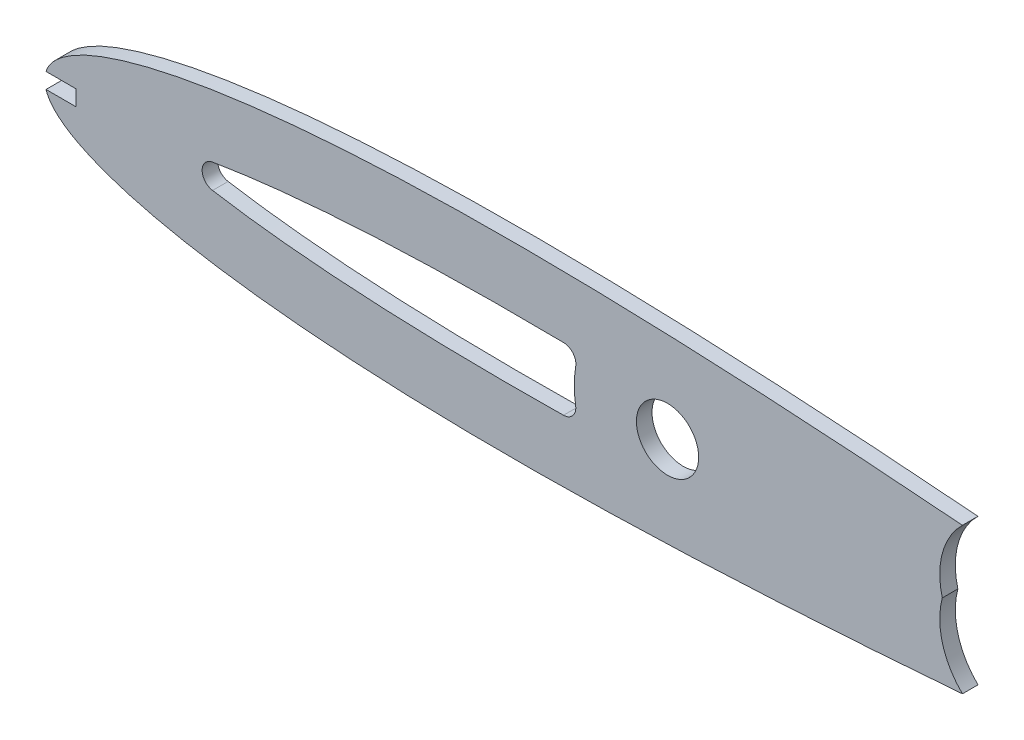
ISO-10303-21;
HEADER;
FILE_DESCRIPTION(('STEP AP214'),'2;1');
FILE_NAME('part.step','',(''),(''),'','','');
FILE_SCHEMA(('AUTOMOTIVE_DESIGN { 1 0 10303 214 1 1 1 1 }'));
ENDSEC;
DATA;
#1=APPLICATION_CONTEXT('core data for automotive mechanical design processes');
#2=APPLICATION_PROTOCOL_DEFINITION('international standard','automotive_design',2000,#1);
#3=PRODUCT_CONTEXT('',#1,'mechanical');
#4=PRODUCT('Part','Part','',(#3));
#5=PRODUCT_RELATED_PRODUCT_CATEGORY('part','',(#4));
#6=PRODUCT_DEFINITION_FORMATION('','',#4);
#7=PRODUCT_DEFINITION_CONTEXT('part definition',#1,'design');
#8=PRODUCT_DEFINITION('design','',#6,#7);
#9=PRODUCT_DEFINITION_SHAPE('','',#8);
#10=(LENGTH_UNIT() NAMED_UNIT(*) SI_UNIT(.MILLI.,.METRE.));
#11=(NAMED_UNIT(*) PLANE_ANGLE_UNIT() SI_UNIT($,.RADIAN.));
#12=(NAMED_UNIT(*) SI_UNIT($,.STERADIAN.) SOLID_ANGLE_UNIT());
#13=UNCERTAINTY_MEASURE_WITH_UNIT(LENGTH_MEASURE(1.E-05),#10,'distance_accuracy_value','');
#14=(GEOMETRIC_REPRESENTATION_CONTEXT(3) GLOBAL_UNCERTAINTY_ASSIGNED_CONTEXT((#13)) GLOBAL_UNIT_ASSIGNED_CONTEXT((#10,
#11,#12)) REPRESENTATION_CONTEXT('',''));
#15=CARTESIAN_POINT('',(0.,0.,0.));
#16=DIRECTION('',(0.,0.,1.));
#17=DIRECTION('',(1.,0.,0.));
#18=AXIS2_PLACEMENT_3D('',#15,#16,#17);
#19=CARTESIAN_POINT('',(34.6393154258819,0.0620980403597377,0.));
#20=DIRECTION('',(0.,0.,1.));
#21=DIRECTION('',(1.,0.,0.));
#22=AXIS2_PLACEMENT_3D('',#19,#20,#21);
#23=CYLINDRICAL_SURFACE('',#22,2.54);
#24=DIRECTION('',(0.,0.,1.));
#25=VECTOR('',#24,1.);
#26=CARTESIAN_POINT('',(34.2198267879566,-2.44302257203632,0.));
#27=LINE('',#26,#25);
#28=CARTESIAN_POINT('',(34.2198267879566,-2.44302257203632,0.));
#29=VERTEX_POINT('',#28);
#30=CARTESIAN_POINT('',(34.2198267879566,-2.44302257203632,3.175));
#31=VERTEX_POINT('',#30);
#32=EDGE_CURVE('E292',#29,#31,#27,.T.);
#33=ORIENTED_EDGE('',*,*,#32,.F.);
#34=CARTESIAN_POINT('',(34.6393154258819,0.0620980403597377,0.));
#35=DIRECTION('',(0.,0.,-1.));
#36=DIRECTION('',(-1.,0.,0.));
#37=AXIS2_PLACEMENT_3D('',#34,#35,#36);
#38=CIRCLE('',#37,2.54);
#39=CARTESIAN_POINT('',(34.2198267879563,2.56721865275575,0.));
#40=VERTEX_POINT('',#39);
#41=EDGE_CURVE('E284',#29,#40,#38,.T.);
#42=ORIENTED_EDGE('',*,*,#41,.T.);
#43=DIRECTION('',(0.,0.,1.));
#44=VECTOR('',#43,1.);
#45=CARTESIAN_POINT('',(34.2198267879563,2.56721865275575,3.175));
#46=LINE('',#45,#44);
#47=CARTESIAN_POINT('',(34.2198267879563,2.56721865275575,3.175));
#48=VERTEX_POINT('',#47);
#49=EDGE_CURVE('E288',#48,#40,#46,.F.);
#50=ORIENTED_EDGE('',*,*,#49,.F.);
#51=CARTESIAN_POINT('',(34.6393154258819,0.0620980403597377,3.175));
#52=DIRECTION('',(0.,0.,-1.));
#53=DIRECTION('',(-1.,0.,0.));
#54=AXIS2_PLACEMENT_3D('',#51,#52,#53);
#55=CIRCLE('',#54,2.54);
#56=EDGE_CURVE('E281',#48,#31,#55,.F.);
#57=ORIENTED_EDGE('',*,*,#56,.T.);
#58=EDGE_LOOP('',(#33,#42,#50,#57));
#59=FACE_BOUND('',#58,.T.);
#60=ADVANCED_FACE('F40',(#59),#23,.F.);
#61=CARTESIAN_POINT('',(0.0170900845920282,-0.403411610866982,3.175));
#62=DIRECTION('',(0.,0.,-1.));
#63=DIRECTION('',(-1.,0.,0.));
#64=AXIS2_PLACEMENT_3D('',#61,#62,#63);
#65=PLANE('',#64);
#66=CARTESIAN_POINT('',(127.,0.,3.175));
#67=DIRECTION('',(0.,0.,1.));
#68=DIRECTION('',(1.,0.,0.));
#69=AXIS2_PLACEMENT_3D('',#66,#67,#68);
#70=CIRCLE('',#69,6.35);
#71=CARTESIAN_POINT('',(133.35,0.,3.175));
#72=VERTEX_POINT('',#71);
#73=EDGE_CURVE('E210',#72,#72,#70,.T.);
#74=ORIENTED_EDGE('',*,*,#73,.F.);
#75=EDGE_LOOP('',(#74));
#76=FACE_BOUND('',#75,.T.);
#77=CARTESIAN_POINT('',(318.77,0.4016502,3.175));
#78=CARTESIAN_POINT('',(318.651672050798,0.50081062510207,3.175));
#79=CARTESIAN_POINT('',(317.88713952083,0.407183951533016,3.175));
#80=CARTESIAN_POINT('',(316.525702267064,0.7904298347905,3.175));
#81=CARTESIAN_POINT('',(314.029007456015,1.02731081399014,3.175));
#82=CARTESIAN_POINT('',(310.665580367581,1.53568645613262,3.175));
#83=CARTESIAN_POINT('',(306.332982445315,2.1029997142592,3.175));
#84=CARTESIAN_POINT('',(301.108142880642,2.80218722429085,3.175));
#85=CARTESIAN_POINT('',(295.004655139781,3.59255228155884,3.175));
#86=CARTESIAN_POINT('',(288.066717305627,4.47252129999186,3.175));
#87=CARTESIAN_POINT('',(280.334877507848,5.42667867616247,3.175));
#88=CARTESIAN_POINT('',(271.857503413929,6.44211126091389,3.175));
#89=CARTESIAN_POINT('',(262.68670258513,7.50622472654808,3.175));
#90=CARTESIAN_POINT('',(252.878949160097,8.60453143464443,3.175));
#91=CARTESIAN_POINT('',(242.494745531819,9.72362194936592,3.175));
#92=CARTESIAN_POINT('',(231.598187206488,10.8495970231666,3.175));
#93=CARTESIAN_POINT('',(220.256428580463,11.9679230852741,3.175));
#94=CARTESIAN_POINT('',(208.539426289446,13.0629021970691,3.175));
#95=CARTESIAN_POINT('',(196.519338709918,14.1201595424354,3.175));
#96=CARTESIAN_POINT('',(184.270405083069,15.1220196708537,3.175));
#97=CARTESIAN_POINT('',(171.867889748649,16.0521472129467,3.175));
#98=CARTESIAN_POINT('',(159.388371015463,16.8932736087619,3.175));
#99=CARTESIAN_POINT('',(146.908740176365,17.6278116310836,3.175));
#100=CARTESIAN_POINT('',(134.505824676557,18.23720410278,3.175));
#101=CARTESIAN_POINT('',(122.256224526093,18.705201006698,3.175));
#102=CARTESIAN_POINT('',(110.23510919994,19.0165345268771,3.175));
#103=CARTESIAN_POINT('',(98.5167667377854,19.1559979551147,3.175));
#104=CARTESIAN_POINT('',(87.1732015056204,19.1125234147679,3.175));
#105=CARTESIAN_POINT('',(76.2743495407503,18.8777134468916,3.175));
#106=CARTESIAN_POINT('',(65.8872982521429,18.4456158754961,3.175));
#107=CARTESIAN_POINT('',(56.0759819312477,17.8151004006929,3.175));
#108=CARTESIAN_POINT('',(46.9007012854392,16.9880642018893,3.175));
#109=CARTESIAN_POINT('',(38.4176025007467,15.9709664672286,3.175));
#110=CARTESIAN_POINT('',(30.6783927826995,14.7724611931374,3.175));
#111=CARTESIAN_POINT('',(23.7299698701266,13.4050657428601,3.175));
#112=CARTESIAN_POINT('',(17.6130594258367,11.8842416218078,3.175));
#113=CARTESIAN_POINT('',(12.3624203887116,10.2248187616682,3.175));
#114=CARTESIAN_POINT('',(8.00472945000562,8.44225238170004,3.175));
#115=CARTESIAN_POINT('',(4.55388340735938,6.54860238146803,3.175));
#116=CARTESIAN_POINT('',(2.01519229032135,4.54013127991722,3.175));
#117=CARTESIAN_POINT('',(0.389181284538515,2.36824959719999,3.175));
#118=CARTESIAN_POINT('',(-0.181372315669338,0.,3.175));
#119=CARTESIAN_POINT('',(0.389181284538492,-2.36824959719995,3.175));
#120=CARTESIAN_POINT('',(2.01519229032142,-4.5401312799173,3.175));
#121=CARTESIAN_POINT('',(4.55388340735933,-6.54860238146799,3.175));
#122=CARTESIAN_POINT('',(8.00472945000561,-8.44225238170004,3.175));
#123=CARTESIAN_POINT('',(12.3624203887116,-10.2248187616682,3.175));
#124=CARTESIAN_POINT('',(17.6130594258367,-11.8842416218078,3.175));
#125=CARTESIAN_POINT('',(23.7299698701266,-13.4050657428601,3.175));
#126=CARTESIAN_POINT('',(30.6783927826996,-14.7724611931374,3.175));
#127=CARTESIAN_POINT('',(38.4176025007467,-15.9709664672285,3.175));
#128=CARTESIAN_POINT('',(46.9007012854392,-16.9880642018893,3.175));
#129=CARTESIAN_POINT('',(56.0759819312477,-17.8151004006929,3.175));
#130=CARTESIAN_POINT('',(65.8872982521429,-18.4456158754961,3.175));
#131=CARTESIAN_POINT('',(76.2743495407503,-18.8777134468916,3.175));
#132=CARTESIAN_POINT('',(87.1732015056205,-19.1125234147679,3.175));
#133=CARTESIAN_POINT('',(98.5167667377854,-19.1559979551147,3.175));
#134=CARTESIAN_POINT('',(110.23510919994,-19.0165345268771,3.175));
#135=CARTESIAN_POINT('',(122.256224526093,-18.705201006698,3.175));
#136=CARTESIAN_POINT('',(134.505824676556,-18.23720410278,3.175));
#137=CARTESIAN_POINT('',(146.908740176365,-17.6278116310836,3.175));
#138=CARTESIAN_POINT('',(159.388371015463,-16.8932736087619,3.175));
#139=CARTESIAN_POINT('',(171.867889748649,-16.0521472129467,3.175));
#140=CARTESIAN_POINT('',(184.270405083069,-15.1220196708537,3.175));
#141=CARTESIAN_POINT('',(196.519338709918,-14.1201595424354,3.175));
#142=CARTESIAN_POINT('',(208.539426289446,-13.0629021970691,3.175));
#143=CARTESIAN_POINT('',(220.256428580463,-11.9679230852741,3.175));
#144=CARTESIAN_POINT('',(231.598187206488,-10.8495970231665,3.175));
#145=CARTESIAN_POINT('',(242.494745531819,-9.72362194936593,3.175));
#146=CARTESIAN_POINT('',(252.878949160097,-8.60453143464443,3.175));
#147=CARTESIAN_POINT('',(262.68670258513,-7.50622472654809,3.175));
#148=CARTESIAN_POINT('',(271.857503413929,-6.44211126091389,3.175));
#149=CARTESIAN_POINT('',(280.334877507848,-5.42667867616247,3.175));
#150=CARTESIAN_POINT('',(288.066717305627,-4.47252129999186,3.175));
#151=CARTESIAN_POINT('',(295.004655139781,-3.59255228155884,3.175));
#152=CARTESIAN_POINT('',(301.108142880642,-2.80218722429085,3.175));
#153=CARTESIAN_POINT('',(306.332982445315,-2.10299971425921,3.175));
#154=CARTESIAN_POINT('',(310.66558036758,-1.53568645613261,3.175));
#155=CARTESIAN_POINT('',(314.029007456015,-1.02731081399015,3.175));
#156=CARTESIAN_POINT('',(316.525702267064,-0.790429834790499,3.175));
#157=CARTESIAN_POINT('',(317.88713952083,-0.407183951532999,3.175));
#158=CARTESIAN_POINT('',(318.961628570184,-0.538768719393173,3.175));
#159=CARTESIAN_POINT('',(318.961628570184,0.241062861088163,3.175));
#160=CARTESIAN_POINT('',(318.77,0.4016502,3.175));
#161=B_SPLINE_CURVE_WITH_KNOTS('',3,(#77,#78,#79,#80,#81,#82,#83,#84,#85,#86,#87,#88,#89,#90,
#91,#92,#93,#94,#95,#96,#97,#98,#99,#100,#101,#102,#103,#104,#105,#106,#107,#108,#109,#110,#111,
#112,#113,#114,#115,#116,#117,#118,#119,#120,#121,#122,#123,#124,#125,#126,#127,#128,#129,#130,
#131,#132,#133,#134,#135,#136,#137,#138,#139,#140,#141,#142,#143,#144,#145,#146,#147,#148,#149,
#150,#151,#152,#153,#154,#155,#156,#157,#158,#159,#160),.UNSPECIFIED.,.T.,.F.,(4,1,1,1,1,1,1,1,
1,1,1,1,1,1,1,1,1,1,1,1,1,1,1,1,1,1,1,1,1,1,1,1,1,1,1,1,1,1,1,1,1,1,1,1,1,1,1,1,1,1,1,1,1,1,1,1,
1,1,1,1,1,1,1,1,1,1,1,1,1,1,1,1,1,1,1,1,1,1,1,1,1,4),(0.,0.00076221465102857,
0.00304470631082172,0.00683224554312919,0.0121011758037585,0.0188175356586858,0.026939454793122,
0.0364148482585568,0.0471846285955964,0.0591804130998147,0.0723278736139124,0.0865440610891483,
0.101740580336553,0.117823336433574,0.134691452208322,0.152240154447155,0.170361289964637,
0.188941007849542,0.207865435445639,0.227016078022501,0.246275695980001,0.265524943249896,
0.284644966110444,0.303520118268662,0.322034575374331,0.340078352914118,0.357542593241702,
0.374325481920834,0.390329890871888,0.405463889739095,0.419643801445685,0.43279337139134,
0.444843816743186,0.455737920704734,0.465428653233085,0.473886320085416,0.481101634077569,
0.487101684418678,0.491975368345093,0.495930677807379,0.499382808099288,0.502834938391198,
0.506790247853484,0.511663931779899,0.517663982121008,0.524879296113161,0.533336962965492,
0.543027695493843,0.553921799455391,0.565972244807237,0.579121814752892,0.593301726459482,
0.608435725326689,0.624440134277742,0.641223022956875,0.658687263284459,0.676731040824246,
0.695245497929915,0.714120650088133,0.733240672948681,0.752489920218576,0.771749538176075,
0.790900180752937,0.809824608349034,0.82840432623394,0.846525461751422,0.864074163990254,
0.880942279765002,0.897025035862024,0.912221555109428,0.926437742584664,0.939585203098762,
0.95158098760298,0.96235076794002,0.971826161405454,0.97994808053989,0.986664440394818,
0.991933370655447,0.995720909887755,0.998003401547548,0.998765616198576,1.),.UNSPECIFIED.);
#162=CARTESIAN_POINT('',(0.257834417446085,-1.5875,3.175));
#163=VERTEX_POINT('',#162);
#164=CARTESIAN_POINT('',(187.131379050379,-14.8815283728172,3.175));
#165=VERTEX_POINT('',#164);
#166=EDGE_CURVE('E160',#163,#165,#161,.T.);
#167=ORIENTED_EDGE('',*,*,#166,.T.);
#168=CARTESIAN_POINT('',(197.744431020284,-3.94440224736243,3.175));
#169=DIRECTION('',(0.,0.,1.));
#170=DIRECTION('',(1.,0.,0.));
#171=AXIS2_PLACEMENT_3D('',#168,#169,#170);
#172=CIRCLE('',#171,15.24);
#173=CARTESIAN_POINT('',(183.023721427638,0.,3.175));
#174=VERTEX_POINT('',#173);
#175=EDGE_CURVE('E147',#174,#165,#172,.T.);
#176=ORIENTED_EDGE('',*,*,#175,.F.);
#177=CARTESIAN_POINT('',(197.744431020284,3.94440224736244,3.175));
#178=DIRECTION('',(0.,0.,1.));
#179=DIRECTION('',(1.,0.,0.));
#180=AXIS2_PLACEMENT_3D('',#177,#178,#179);
#181=CIRCLE('',#180,15.24);
#182=CARTESIAN_POINT('',(187.131379050379,14.8815283728172,3.175));
#183=VERTEX_POINT('',#182);
#184=EDGE_CURVE('E135',#183,#174,#181,.T.);
#185=ORIENTED_EDGE('',*,*,#184,.F.);
#186=CARTESIAN_POINT('',(0.257834424287373,1.5875,3.175));
#187=VERTEX_POINT('',#186);
#188=EDGE_CURVE('E225',#183,#187,#161,.T.);
#189=ORIENTED_EDGE('',*,*,#188,.T.);
#190=DIRECTION('',(-1.,0.,0.));
#191=VECTOR('',#190,1.);
#192=CARTESIAN_POINT('',(6.35,1.5875,3.175));
#193=LINE('',#192,#191);
#194=CARTESIAN_POINT('',(6.35,1.5875,3.175));
#195=VERTEX_POINT('',#194);
#196=EDGE_CURVE('E175',#195,#187,#193,.T.);
#197=ORIENTED_EDGE('',*,*,#196,.F.);
#198=DIRECTION('',(0.,-1.,0.));
#199=VECTOR('',#198,1.);
#200=CARTESIAN_POINT('',(6.35,1.5875,3.175));
#201=LINE('',#200,#199);
#202=CARTESIAN_POINT('',(6.35,-1.5875,3.175));
#203=VERTEX_POINT('',#202);
#204=EDGE_CURVE('E181',#195,#203,#201,.T.);
#205=ORIENTED_EDGE('',*,*,#204,.T.);
#206=DIRECTION('',(-1.,0.,0.));
#207=VECTOR('',#206,1.);
#208=CARTESIAN_POINT('',(6.35,-1.5875,3.175));
#209=LINE('',#208,#207);
#210=EDGE_CURVE('E192',#203,#163,#209,.T.);
#211=ORIENTED_EDGE('',*,*,#210,.T.);
#212=EDGE_LOOP('',(#167,#176,#185,#189,#197,#205,#211));
#213=FACE_BOUND('',#212,.T.);
#214=CARTESIAN_POINT('',(127.,0.,3.175));
#215=DIRECTION('',(0.,0.,-1.));
#216=DIRECTION('',(1.,0.,0.));
#217=AXIS2_PLACEMENT_3D('',#214,#215,#216);
#218=CIRCLE('',#217,19.05);
#219=CARTESIAN_POINT('',(108.250589861381,-3.37077431072522,3.175));
#220=VERTEX_POINT('',#219);
#221=CARTESIAN_POINT('',(108.270570821231,3.4800837112767,3.175));
#222=VERTEX_POINT('',#221);
#223=EDGE_CURVE('E360',#220,#222,#218,.T.);
#224=ORIENTED_EDGE('',*,*,#223,.F.);
#225=CARTESIAN_POINT('',(105.750668509565,-3.82021088548858,3.175));
#226=DIRECTION('',(0.,0.,-1.));
#227=DIRECTION('',(-1.,0.,0.));
#228=AXIS2_PLACEMENT_3D('',#225,#226,#227);
#229=CIRCLE('',#228,2.54);
#230=CARTESIAN_POINT('',(105.78563504113,-6.35997019331095,3.175));
#231=VERTEX_POINT('',#230);
#232=EDGE_CURVE('E265',#220,#231,#229,.T.);
#233=ORIENTED_EDGE('',*,*,#232,.T.);
#234=CARTESIAN_POINT('',(22.3075001538087,0.0620980403591206,3.175));
#235=CARTESIAN_POINT('',(22.366805434694,0.0463599552269764,3.175));
#236=CARTESIAN_POINT('',(22.4641575743674,0.0206307576100526,3.175));
#237=CARTESIAN_POINT('',(23.2116228860384,-0.175596789517985,3.175));
#238=CARTESIAN_POINT('',(24.6595160973937,-0.537941707269228,3.175));
#239=CARTESIAN_POINT('',(27.6590804680787,-1.22392879960898,3.175));
#240=CARTESIAN_POINT('',(31.6148674012278,-2.01137925455217,3.175));
#241=CARTESIAN_POINT('',(36.4764457954045,-2.82760799183878,3.175));
#242=CARTESIAN_POINT('',(43.0528389793576,-3.76280952629645,3.175));
#243=CARTESIAN_POINT('',(51.4085727700648,-4.68431192061461,3.175));
#244=CARTESIAN_POINT('',(64.9446034358027,-5.73864722919803,3.175));
#245=CARTESIAN_POINT('',(80.7029524920726,-6.36035669842717,3.175));
#246=CARTESIAN_POINT('',(94.8432621201463,-6.46161549846858,3.175));
#247=CARTESIAN_POINT('',(103.83524223639,-6.39018445634634,3.175));
#248=CARTESIAN_POINT('',(107.294557686626,-6.33959590129162,3.175));
#249=CARTESIAN_POINT('',(109.024993683417,-6.30885472322853,3.175));
#250=B_SPLINE_CURVE_WITH_KNOTS('',3,(#234,#235,#236,#237,#238,#239,#240,#241,#242,#243,#244,
#245,#246,#247,#248,#249),.UNSPECIFIED.,.F.,.F.,(4,1,1,1,1,1,1,1,1,1,1,1,1,4),
(0.536010578880515,0.536329989431581,0.536542929798959,0.540060983851749,0.544111388822982,
0.552212198765449,0.560313008707916,0.568413818650383,0.584615438535317,0.600817058420251,
0.633220298190119,0.65917402529176,0.667274835234226,0.675375645176706),.UNSPECIFIED.);
#251=EDGE_CURVE('E423',#31,#231,#250,.T.);
#252=ORIENTED_EDGE('',*,*,#251,.F.);
#253=ORIENTED_EDGE('',*,*,#56,.F.);
#254=CARTESIAN_POINT('',(109.068787507412,6.43227164737678,3.175));
#255=CARTESIAN_POINT('',(107.323740388384,6.46336480746945,3.175));
#256=CARTESIAN_POINT('',(103.8498191486,6.51426474010784,3.175));
#257=CARTESIAN_POINT('',(94.8432621201402,6.5858115791963,3.175));
#258=CARTESIAN_POINT('',(80.7029524920684,6.48455277915276,3.175));
#259=CARTESIAN_POINT('',(64.9446034358007,5.8628433099214,3.175));
#260=CARTESIAN_POINT('',(51.4085727700634,4.80850800133612,3.175));
#261=CARTESIAN_POINT('',(43.0528389793568,3.8870056070169,3.175));
#262=CARTESIAN_POINT('',(36.476445795404,2.95180407255844,3.175));
#263=CARTESIAN_POINT('',(31.6148674012275,2.13557533527128,3.175));
#264=CARTESIAN_POINT('',(27.6590804680785,1.34812488032769,3.175));
#265=CARTESIAN_POINT('',(24.6595160973903,0.662137787986875,3.175));
#266=CARTESIAN_POINT('',(23.2116228860331,0.299792870234967,3.175));
#267=CARTESIAN_POINT('',(22.4641575743621,0.103565323106815,3.175));
#268=CARTESIAN_POINT('',(22.3668054346921,0.077836125490745,3.175));
#269=CARTESIAN_POINT('',(22.3075001538087,0.0620980403591206,3.175));
#270=B_SPLINE_CURVE_WITH_KNOTS('',3,(#254,#255,#256,#257,#258,#259,#260,#261,#262,#263,#264,
#265,#266,#267,#268,#269),.UNSPECIFIED.,.F.,.F.,(4,1,1,1,1,1,1,1,1,1,1,1,1,4),
(0.323321632926748,0.33149078096435,0.339591590906816,0.36554531800845,0.397948557778316,
0.414150177663249,0.430351797548182,0.438452607490649,0.446553417433115,0.454654227375582,
0.458704632346815,0.462222686399623,0.462435626766993,0.462755037318048),.UNSPECIFIED.);
#271=CARTESIAN_POINT('',(105.808352713447,6.483853180247,3.175));
#272=VERTEX_POINT('',#271);
#273=EDGE_CURVE('E355',#272,#48,#270,.T.);
#274=ORIENTED_EDGE('',*,*,#273,.F.);
#275=CARTESIAN_POINT('',(105.773313597396,3.94409487278026,3.175));
#276=DIRECTION('',(0.,0.,-1.));
#277=DIRECTION('',(-1.,0.,0.));
#278=AXIS2_PLACEMENT_3D('',#275,#276,#277);
#279=CIRCLE('',#278,2.54);
#280=EDGE_CURVE('E49',#272,#222,#279,.T.);
#281=ORIENTED_EDGE('',*,*,#280,.T.);
#282=EDGE_LOOP('',(#224,#233,#252,#253,#274,#281));
#283=FACE_BOUND('',#282,.T.);
#284=ADVANCED_FACE('F156',(#76,#213,#283),#65,.F.);
#285=CARTESIAN_POINT('',(0.0170900845920282,-0.403411610866982,0.));
#286=DIRECTION('',(0.,0.,-1.));
#287=DIRECTION('',(-1.,0.,0.));
#288=AXIS2_PLACEMENT_3D('',#285,#286,#287);
#289=PLANE('',#288);
#290=ORIENTED_EDGE('',*,*,#41,.F.);
#291=CARTESIAN_POINT('',(22.3075001538087,0.0620980403591206,0.));
#292=CARTESIAN_POINT('',(22.366805434694,0.0463599552269764,0.));
#293=CARTESIAN_POINT('',(22.4641575743674,0.0206307576100526,0.));
#294=CARTESIAN_POINT('',(23.2116228860384,-0.175596789517985,0.));
#295=CARTESIAN_POINT('',(24.6595160973937,-0.537941707269228,0.));
#296=CARTESIAN_POINT('',(27.6590804680787,-1.22392879960898,0.));
#297=CARTESIAN_POINT('',(31.6148674012278,-2.01137925455217,0.));
#298=CARTESIAN_POINT('',(36.4764457954045,-2.82760799183878,0.));
#299=CARTESIAN_POINT('',(43.0528389793576,-3.76280952629645,0.));
#300=CARTESIAN_POINT('',(51.4085727700648,-4.68431192061461,0.));
#301=CARTESIAN_POINT('',(64.9446034358027,-5.73864722919803,0.));
#302=CARTESIAN_POINT('',(80.7029524920726,-6.36035669842717,0.));
#303=CARTESIAN_POINT('',(94.8432621201463,-6.46161549846858,0.));
#304=CARTESIAN_POINT('',(103.83524223639,-6.39018445634634,0.));
#305=CARTESIAN_POINT('',(107.294557686626,-6.33959590129162,0.));
#306=CARTESIAN_POINT('',(109.024993683417,-6.30885472322853,0.));
#307=B_SPLINE_CURVE_WITH_KNOTS('',3,(#291,#292,#293,#294,#295,#296,#297,#298,#299,#300,#301,
#302,#303,#304,#305,#306),.UNSPECIFIED.,.F.,.F.,(4,1,1,1,1,1,1,1,1,1,1,1,1,4),
(0.536010578880515,0.536329989431581,0.536542929798959,0.540060983851749,0.544111388822982,
0.552212198765449,0.560313008707916,0.568413818650383,0.584615438535317,0.600817058420251,
0.633220298190119,0.65917402529176,0.667274835234226,0.675375645176706),.UNSPECIFIED.);
#308=CARTESIAN_POINT('',(105.78563504113,-6.35997019331095,0.));
#309=VERTEX_POINT('',#308);
#310=EDGE_CURVE('E347',#29,#309,#307,.T.);
#311=ORIENTED_EDGE('',*,*,#310,.T.);
#312=CARTESIAN_POINT('',(105.750668509565,-3.82021088548858,0.));
#313=DIRECTION('',(0.,0.,-1.));
#314=DIRECTION('',(-1.,0.,0.));
#315=AXIS2_PLACEMENT_3D('',#312,#313,#314);
#316=CIRCLE('',#315,2.54);
#317=CARTESIAN_POINT('',(108.250589861381,-3.37077431072522,0.));
#318=VERTEX_POINT('',#317);
#319=EDGE_CURVE('E258',#309,#318,#316,.F.);
#320=ORIENTED_EDGE('',*,*,#319,.T.);
#321=CARTESIAN_POINT('',(127.,0.,0.));
#322=DIRECTION('',(0.,0.,-1.));
#323=DIRECTION('',(1.,0.,0.));
#324=AXIS2_PLACEMENT_3D('',#321,#322,#323);
#325=CIRCLE('',#324,19.05);
#326=CARTESIAN_POINT('',(108.270570821231,3.4800837112767,0.));
#327=VERTEX_POINT('',#326);
#328=EDGE_CURVE('E165',#318,#327,#325,.T.);
#329=ORIENTED_EDGE('',*,*,#328,.T.);
#330=CARTESIAN_POINT('',(105.773313597396,3.94409487278026,0.));
#331=DIRECTION('',(0.,0.,-1.));
#332=DIRECTION('',(-1.,0.,0.));
#333=AXIS2_PLACEMENT_3D('',#330,#331,#332);
#334=CIRCLE('',#333,2.54);
#335=CARTESIAN_POINT('',(105.808352713447,6.483853180247,0.));
#336=VERTEX_POINT('',#335);
#337=EDGE_CURVE('E11',#327,#336,#334,.F.);
#338=ORIENTED_EDGE('',*,*,#337,.T.);
#339=CARTESIAN_POINT('',(109.068787507412,6.43227164737678,0.));
#340=CARTESIAN_POINT('',(107.323740388384,6.46336480746945,0.));
#341=CARTESIAN_POINT('',(103.8498191486,6.51426474010784,0.));
#342=CARTESIAN_POINT('',(94.8432621201402,6.5858115791963,0.));
#343=CARTESIAN_POINT('',(80.7029524920684,6.48455277915276,0.));
#344=CARTESIAN_POINT('',(64.9446034358007,5.8628433099214,0.));
#345=CARTESIAN_POINT('',(51.4085727700634,4.80850800133612,0.));
#346=CARTESIAN_POINT('',(43.0528389793568,3.8870056070169,0.));
#347=CARTESIAN_POINT('',(36.476445795404,2.95180407255844,0.));
#348=CARTESIAN_POINT('',(31.6148674012275,2.13557533527128,0.));
#349=CARTESIAN_POINT('',(27.6590804680785,1.34812488032769,0.));
#350=CARTESIAN_POINT('',(24.6595160973903,0.662137787986875,0.));
#351=CARTESIAN_POINT('',(23.2116228860331,0.299792870234967,0.));
#352=CARTESIAN_POINT('',(22.4641575743621,0.103565323106815,0.));
#353=CARTESIAN_POINT('',(22.3668054346921,0.077836125490745,0.));
#354=CARTESIAN_POINT('',(22.3075001538087,0.0620980403591206,0.));
#355=B_SPLINE_CURVE_WITH_KNOTS('',3,(#339,#340,#341,#342,#343,#344,#345,#346,#347,#348,#349,
#350,#351,#352,#353,#354),.UNSPECIFIED.,.F.,.F.,(4,1,1,1,1,1,1,1,1,1,1,1,1,4),
(0.323321632926748,0.33149078096435,0.339591590906816,0.36554531800845,0.397948557778316,
0.414150177663249,0.430351797548182,0.438452607490649,0.446553417433115,0.454654227375582,
0.458704632346815,0.462222686399623,0.462435626766993,0.462755037318048),.UNSPECIFIED.);
#356=EDGE_CURVE('E162',#336,#40,#355,.T.);
#357=ORIENTED_EDGE('',*,*,#356,.T.);
#358=EDGE_LOOP('',(#290,#311,#320,#329,#338,#357));
#359=FACE_BOUND('',#358,.T.);
#360=CARTESIAN_POINT('',(127.,0.,0.));
#361=DIRECTION('',(0.,0.,1.));
#362=DIRECTION('',(1.,0.,0.));
#363=AXIS2_PLACEMENT_3D('',#360,#361,#362);
#364=CIRCLE('',#363,6.35);
#365=CARTESIAN_POINT('',(133.35,0.,0.));
#366=VERTEX_POINT('',#365);
#367=EDGE_CURVE('E211',#366,#366,#364,.T.);
#368=ORIENTED_EDGE('',*,*,#367,.T.);
#369=EDGE_LOOP('',(#368));
#370=FACE_BOUND('',#369,.T.);
#371=CARTESIAN_POINT('',(197.744431020284,-3.94440224736243,0.));
#372=DIRECTION('',(0.,0.,1.));
#373=DIRECTION('',(1.,0.,0.));
#374=AXIS2_PLACEMENT_3D('',#371,#372,#373);
#375=CIRCLE('',#374,15.24);
#376=CARTESIAN_POINT('',(183.023721427638,0.,0.));
#377=VERTEX_POINT('',#376);
#378=CARTESIAN_POINT('',(187.131379050379,-14.8815283728172,0.));
#379=VERTEX_POINT('',#378);
#380=EDGE_CURVE('E146',#377,#379,#375,.T.);
#381=ORIENTED_EDGE('',*,*,#380,.T.);
#382=CARTESIAN_POINT('',(318.77,0.4016502,0.));
#383=CARTESIAN_POINT('',(318.651672050798,0.50081062510207,0.));
#384=CARTESIAN_POINT('',(317.88713952083,0.407183951533016,0.));
#385=CARTESIAN_POINT('',(316.525702267064,0.7904298347905,0.));
#386=CARTESIAN_POINT('',(314.029007456015,1.02731081399014,0.));
#387=CARTESIAN_POINT('',(310.665580367581,1.53568645613262,0.));
#388=CARTESIAN_POINT('',(306.332982445315,2.1029997142592,0.));
#389=CARTESIAN_POINT('',(301.108142880642,2.80218722429085,0.));
#390=CARTESIAN_POINT('',(295.004655139781,3.59255228155884,0.));
#391=CARTESIAN_POINT('',(288.066717305627,4.47252129999186,0.));
#392=CARTESIAN_POINT('',(280.334877507848,5.42667867616247,0.));
#393=CARTESIAN_POINT('',(271.857503413929,6.44211126091389,0.));
#394=CARTESIAN_POINT('',(262.68670258513,7.50622472654808,0.));
#395=CARTESIAN_POINT('',(252.878949160097,8.60453143464443,0.));
#396=CARTESIAN_POINT('',(242.494745531819,9.72362194936592,0.));
#397=CARTESIAN_POINT('',(231.598187206488,10.8495970231666,0.));
#398=CARTESIAN_POINT('',(220.256428580463,11.9679230852741,0.));
#399=CARTESIAN_POINT('',(208.539426289446,13.0629021970691,0.));
#400=CARTESIAN_POINT('',(196.519338709918,14.1201595424354,0.));
#401=CARTESIAN_POINT('',(184.270405083069,15.1220196708537,0.));
#402=CARTESIAN_POINT('',(171.867889748649,16.0521472129467,0.));
#403=CARTESIAN_POINT('',(159.388371015463,16.8932736087619,0.));
#404=CARTESIAN_POINT('',(146.908740176365,17.6278116310836,0.));
#405=CARTESIAN_POINT('',(134.505824676557,18.23720410278,0.));
#406=CARTESIAN_POINT('',(122.256224526093,18.705201006698,0.));
#407=CARTESIAN_POINT('',(110.23510919994,19.0165345268771,0.));
#408=CARTESIAN_POINT('',(98.5167667377854,19.1559979551147,0.));
#409=CARTESIAN_POINT('',(87.1732015056204,19.1125234147679,0.));
#410=CARTESIAN_POINT('',(76.2743495407503,18.8777134468916,0.));
#411=CARTESIAN_POINT('',(65.8872982521429,18.4456158754961,0.));
#412=CARTESIAN_POINT('',(56.0759819312477,17.8151004006929,0.));
#413=CARTESIAN_POINT('',(46.9007012854392,16.9880642018893,0.));
#414=CARTESIAN_POINT('',(38.4176025007467,15.9709664672286,0.));
#415=CARTESIAN_POINT('',(30.6783927826995,14.7724611931374,0.));
#416=CARTESIAN_POINT('',(23.7299698701266,13.4050657428601,0.));
#417=CARTESIAN_POINT('',(17.6130594258367,11.8842416218078,0.));
#418=CARTESIAN_POINT('',(12.3624203887116,10.2248187616682,0.));
#419=CARTESIAN_POINT('',(8.00472945000562,8.44225238170004,0.));
#420=CARTESIAN_POINT('',(4.55388340735938,6.54860238146803,0.));
#421=CARTESIAN_POINT('',(2.01519229032135,4.54013127991722,0.));
#422=CARTESIAN_POINT('',(0.389181284538515,2.36824959719999,0.));
#423=CARTESIAN_POINT('',(-0.181372315669338,0.,0.));
#424=CARTESIAN_POINT('',(0.389181284538492,-2.36824959719995,0.));
#425=CARTESIAN_POINT('',(2.01519229032142,-4.5401312799173,0.));
#426=CARTESIAN_POINT('',(4.55388340735933,-6.54860238146799,0.));
#427=CARTESIAN_POINT('',(8.00472945000561,-8.44225238170004,0.));
#428=CARTESIAN_POINT('',(12.3624203887116,-10.2248187616682,0.));
#429=CARTESIAN_POINT('',(17.6130594258367,-11.8842416218078,0.));
#430=CARTESIAN_POINT('',(23.7299698701266,-13.4050657428601,0.));
#431=CARTESIAN_POINT('',(30.6783927826996,-14.7724611931374,0.));
#432=CARTESIAN_POINT('',(38.4176025007467,-15.9709664672285,0.));
#433=CARTESIAN_POINT('',(46.9007012854392,-16.9880642018893,0.));
#434=CARTESIAN_POINT('',(56.0759819312477,-17.8151004006929,0.));
#435=CARTESIAN_POINT('',(65.8872982521429,-18.4456158754961,0.));
#436=CARTESIAN_POINT('',(76.2743495407503,-18.8777134468916,0.));
#437=CARTESIAN_POINT('',(87.1732015056205,-19.1125234147679,0.));
#438=CARTESIAN_POINT('',(98.5167667377854,-19.1559979551147,0.));
#439=CARTESIAN_POINT('',(110.23510919994,-19.0165345268771,0.));
#440=CARTESIAN_POINT('',(122.256224526093,-18.705201006698,0.));
#441=CARTESIAN_POINT('',(134.505824676556,-18.23720410278,0.));
#442=CARTESIAN_POINT('',(146.908740176365,-17.6278116310836,0.));
#443=CARTESIAN_POINT('',(159.388371015463,-16.8932736087619,0.));
#444=CARTESIAN_POINT('',(171.867889748649,-16.0521472129467,0.));
#445=CARTESIAN_POINT('',(184.270405083069,-15.1220196708537,0.));
#446=CARTESIAN_POINT('',(196.519338709918,-14.1201595424354,0.));
#447=CARTESIAN_POINT('',(208.539426289446,-13.0629021970691,0.));
#448=CARTESIAN_POINT('',(220.256428580463,-11.9679230852741,0.));
#449=CARTESIAN_POINT('',(231.598187206488,-10.8495970231665,0.));
#450=CARTESIAN_POINT('',(242.494745531819,-9.72362194936593,0.));
#451=CARTESIAN_POINT('',(252.878949160097,-8.60453143464443,0.));
#452=CARTESIAN_POINT('',(262.68670258513,-7.50622472654809,0.));
#453=CARTESIAN_POINT('',(271.857503413929,-6.44211126091389,0.));
#454=CARTESIAN_POINT('',(280.334877507848,-5.42667867616247,0.));
#455=CARTESIAN_POINT('',(288.066717305627,-4.47252129999186,0.));
#456=CARTESIAN_POINT('',(295.004655139781,-3.59255228155884,0.));
#457=CARTESIAN_POINT('',(301.108142880642,-2.80218722429085,0.));
#458=CARTESIAN_POINT('',(306.332982445315,-2.10299971425921,0.));
#459=CARTESIAN_POINT('',(310.66558036758,-1.53568645613261,0.));
#460=CARTESIAN_POINT('',(314.029007456015,-1.02731081399015,0.));
#461=CARTESIAN_POINT('',(316.525702267064,-0.790429834790499,0.));
#462=CARTESIAN_POINT('',(317.88713952083,-0.407183951532999,0.));
#463=CARTESIAN_POINT('',(318.961628570184,-0.538768719393173,0.));
#464=CARTESIAN_POINT('',(318.961628570184,0.241062861088163,0.));
#465=CARTESIAN_POINT('',(318.77,0.4016502,0.));
#466=B_SPLINE_CURVE_WITH_KNOTS('',3,(#382,#383,#384,#385,#386,#387,#388,#389,#390,#391,#392,
#393,#394,#395,#396,#397,#398,#399,#400,#401,#402,#403,#404,#405,#406,#407,#408,#409,#410,#411,
#412,#413,#414,#415,#416,#417,#418,#419,#420,#421,#422,#423,#424,#425,#426,#427,#428,#429,#430,
#431,#432,#433,#434,#435,#436,#437,#438,#439,#440,#441,#442,#443,#444,#445,#446,#447,#448,#449,
#450,#451,#452,#453,#454,#455,#456,#457,#458,#459,#460,#461,#462,#463,#464,#465),.UNSPECIFIED.,
.T.,.F.,(4,1,1,1,1,1,1,1,1,1,1,1,1,1,1,1,1,1,1,1,1,1,1,1,1,1,1,1,1,1,1,1,1,1,1,1,1,1,1,1,1,1,1,
1,1,1,1,1,1,1,1,1,1,1,1,1,1,1,1,1,1,1,1,1,1,1,1,1,1,1,1,1,1,1,1,1,1,1,1,1,1,4),(0.,
0.00076221465102857,0.00304470631082172,0.00683224554312919,0.0121011758037585,
0.0188175356586858,0.026939454793122,0.0364148482585568,0.0471846285955964,0.0591804130998147,
0.0723278736139124,0.0865440610891483,0.101740580336553,0.117823336433574,0.134691452208322,
0.152240154447155,0.170361289964637,0.188941007849542,0.207865435445639,0.227016078022501,
0.246275695980001,0.265524943249896,0.284644966110444,0.303520118268662,0.322034575374331,
0.340078352914118,0.357542593241702,0.374325481920834,0.390329890871888,0.405463889739095,
0.419643801445685,0.43279337139134,0.444843816743186,0.455737920704734,0.465428653233085,
0.473886320085416,0.481101634077569,0.487101684418678,0.491975368345093,0.495930677807379,
0.499382808099288,0.502834938391198,0.506790247853484,0.511663931779899,0.517663982121008,
0.524879296113161,0.533336962965492,0.543027695493843,0.553921799455391,0.565972244807237,
0.579121814752892,0.593301726459482,0.608435725326689,0.624440134277742,0.641223022956875,
0.658687263284459,0.676731040824246,0.695245497929915,0.714120650088133,0.733240672948681,
0.752489920218576,0.771749538176075,0.790900180752937,0.809824608349034,0.82840432623394,
0.846525461751422,0.864074163990254,0.880942279765002,0.897025035862024,0.912221555109428,
0.926437742584664,0.939585203098762,0.95158098760298,0.96235076794002,0.971826161405454,
0.97994808053989,0.986664440394818,0.991933370655447,0.995720909887755,0.998003401547548,
0.998765616198576,1.),.UNSPECIFIED.);
#467=CARTESIAN_POINT('',(0.257834417446085,-1.5875,0.));
#468=VERTEX_POINT('',#467);
#469=EDGE_CURVE('E226',#468,#379,#466,.T.);
#470=ORIENTED_EDGE('',*,*,#469,.F.);
#471=DIRECTION('',(-1.,0.,0.));
#472=VECTOR('',#471,1.);
#473=CARTESIAN_POINT('',(6.35,-1.5875,0.));
#474=LINE('',#473,#472);
#475=CARTESIAN_POINT('',(6.35,-1.5875,0.));
#476=VERTEX_POINT('',#475);
#477=EDGE_CURVE('E180',#476,#468,#474,.T.);
#478=ORIENTED_EDGE('',*,*,#477,.F.);
#479=DIRECTION('',(0.,-1.,0.));
#480=VECTOR('',#479,1.);
#481=CARTESIAN_POINT('',(6.35,1.5875,0.));
#482=LINE('',#481,#480);
#483=CARTESIAN_POINT('',(6.35,1.5875,0.));
#484=VERTEX_POINT('',#483);
#485=EDGE_CURVE('E184',#484,#476,#482,.T.);
#486=ORIENTED_EDGE('',*,*,#485,.F.);
#487=DIRECTION('',(-1.,0.,0.));
#488=VECTOR('',#487,1.);
#489=CARTESIAN_POINT('',(6.35,1.5875,0.));
#490=LINE('',#489,#488);
#491=CARTESIAN_POINT('',(0.257834424287373,1.5875,0.));
#492=VERTEX_POINT('',#491);
#493=EDGE_CURVE('E176',#484,#492,#490,.T.);
#494=ORIENTED_EDGE('',*,*,#493,.T.);
#495=CARTESIAN_POINT('',(187.131379050379,14.8815283728172,0.));
#496=VERTEX_POINT('',#495);
#497=EDGE_CURVE('E215',#496,#492,#466,.T.);
#498=ORIENTED_EDGE('',*,*,#497,.F.);
#499=CARTESIAN_POINT('',(197.744431020284,3.94440224736244,0.));
#500=DIRECTION('',(0.,0.,-1.));
#501=DIRECTION('',(-1.,0.,0.));
#502=AXIS2_PLACEMENT_3D('',#499,#500,#501);
#503=CIRCLE('',#502,15.24);
#504=EDGE_CURVE('E224',#377,#496,#503,.T.);
#505=ORIENTED_EDGE('',*,*,#504,.F.);
#506=EDGE_LOOP('',(#381,#470,#478,#486,#494,#498,#505));
#507=FACE_BOUND('',#506,.T.);
#508=ADVANCED_FACE('F239',(#359,#370,#507),#289,.T.);
#509=DIRECTION('',(0.,0.,-1.));
#510=VECTOR('',#509,1.);
#511=SURFACE_OF_LINEAR_EXTRUSION('',#161,#510);
#512=ORIENTED_EDGE('',*,*,#188,.F.);
#513=DIRECTION('',(0.,0.,-1.));
#514=VECTOR('',#513,1.);
#515=CARTESIAN_POINT('',(187.131379050379,14.8815283728172,3.175));
#516=LINE('',#515,#514);
#517=EDGE_CURVE('E141',#183,#496,#516,.T.);
#518=ORIENTED_EDGE('',*,*,#517,.T.);
#519=ORIENTED_EDGE('',*,*,#497,.T.);
#520=DIRECTION('',(0.,0.,-1.));
#521=VECTOR('',#520,1.);
#522=CARTESIAN_POINT('',(0.257834423717523,1.58750000000001,3.175));
#523=LINE('',#522,#521);
#524=EDGE_CURVE('E206',#492,#187,#523,.F.);
#525=ORIENTED_EDGE('',*,*,#524,.T.);
#526=EDGE_LOOP('',(#512,#518,#519,#525));
#527=FACE_BOUND('',#526,.T.);
#528=ADVANCED_FACE('F234',(#527),#511,.F.);
#529=ORIENTED_EDGE('',*,*,#469,.T.);
#530=DIRECTION('',(0.,0.,-1.));
#531=VECTOR('',#530,1.);
#532=CARTESIAN_POINT('',(187.131379050379,-14.8815283728172,3.175));
#533=LINE('',#532,#531);
#534=EDGE_CURVE('E172',#379,#165,#533,.F.);
#535=ORIENTED_EDGE('',*,*,#534,.T.);
#536=ORIENTED_EDGE('',*,*,#166,.F.);
#537=DIRECTION('',(0.,0.,-1.));
#538=VECTOR('',#537,1.);
#539=CARTESIAN_POINT('',(0.257834423717495,-1.58749999999994,3.175));
#540=LINE('',#539,#538);
#541=EDGE_CURVE('E201',#468,#163,#540,.F.);
#542=ORIENTED_EDGE('',*,*,#541,.F.);
#543=EDGE_LOOP('',(#529,#535,#536,#542));
#544=FACE_BOUND('',#543,.T.);
#545=ADVANCED_FACE('F238',(#544),#511,.F.);
#546=CARTESIAN_POINT('',(127.,0.,0.));
#547=DIRECTION('',(0.,0.,1.));
#548=DIRECTION('',(1.,0.,0.));
#549=AXIS2_PLACEMENT_3D('',#546,#547,#548);
#550=CYLINDRICAL_SURFACE('',#549,6.35);
#551=ORIENTED_EDGE('',*,*,#367,.F.);
#552=EDGE_LOOP('',(#551));
#553=FACE_BOUND('',#552,.T.);
#554=ORIENTED_EDGE('',*,*,#73,.T.);
#555=EDGE_LOOP('',(#554));
#556=FACE_BOUND('',#555,.T.);
#557=ADVANCED_FACE('F326',(#553,#556),#550,.F.);
#558=CARTESIAN_POINT('',(6.35,1.5875,0.));
#559=DIRECTION('',(0.,1.,0.));
#560=DIRECTION('',(-1.,0.,0.));
#561=AXIS2_PLACEMENT_3D('',#558,#559,#560);
#562=PLANE('',#561);
#563=ORIENTED_EDGE('',*,*,#493,.F.);
#564=DIRECTION('',(0.,0.,1.));
#565=VECTOR('',#564,1.);
#566=CARTESIAN_POINT('',(6.35,1.5875,0.));
#567=LINE('',#566,#565);
#568=EDGE_CURVE('E198',#484,#195,#567,.T.);
#569=ORIENTED_EDGE('',*,*,#568,.T.);
#570=ORIENTED_EDGE('',*,*,#196,.T.);
#571=ORIENTED_EDGE('',*,*,#524,.F.);
#572=EDGE_LOOP('',(#563,#569,#570,#571));
#573=FACE_BOUND('',#572,.T.);
#574=ADVANCED_FACE('F310',(#573),#562,.F.);
#575=CARTESIAN_POINT('',(6.35,-1.5875,0.));
#576=DIRECTION('',(0.,1.,0.));
#577=DIRECTION('',(-1.,0.,0.));
#578=AXIS2_PLACEMENT_3D('',#575,#576,#577);
#579=PLANE('',#578);
#580=ORIENTED_EDGE('',*,*,#541,.T.);
#581=ORIENTED_EDGE('',*,*,#210,.F.);
#582=DIRECTION('',(0.,0.,1.));
#583=VECTOR('',#582,1.);
#584=CARTESIAN_POINT('',(6.35,-1.5875,0.));
#585=LINE('',#584,#583);
#586=EDGE_CURVE('E188',#476,#203,#585,.T.);
#587=ORIENTED_EDGE('',*,*,#586,.F.);
#588=ORIENTED_EDGE('',*,*,#477,.T.);
#589=EDGE_LOOP('',(#580,#581,#587,#588));
#590=FACE_BOUND('',#589,.T.);
#591=ADVANCED_FACE('F318',(#590),#579,.T.);
#592=CARTESIAN_POINT('',(6.35,1.5875,0.));
#593=DIRECTION('',(-1.,0.,0.));
#594=DIRECTION('',(0.,-1.,0.));
#595=AXIS2_PLACEMENT_3D('',#592,#593,#594);
#596=PLANE('',#595);
#597=ORIENTED_EDGE('',*,*,#204,.F.);
#598=ORIENTED_EDGE('',*,*,#568,.F.);
#599=ORIENTED_EDGE('',*,*,#485,.T.);
#600=ORIENTED_EDGE('',*,*,#586,.T.);
#601=EDGE_LOOP('',(#597,#598,#599,#600));
#602=FACE_BOUND('',#601,.T.);
#603=ADVANCED_FACE('F313',(#602),#596,.T.);
#604=CARTESIAN_POINT('',(197.744431020284,-3.94440224736243,0.));
#605=DIRECTION('',(0.,0.,1.));
#606=DIRECTION('',(1.,0.,0.));
#607=AXIS2_PLACEMENT_3D('',#604,#605,#606);
#608=CYLINDRICAL_SURFACE('',#607,15.24);
#609=ORIENTED_EDGE('',*,*,#380,.F.);
#610=DIRECTION('',(0.,0.,1.));
#611=VECTOR('',#610,1.);
#612=CARTESIAN_POINT('',(183.023721427638,0.,0.));
#613=LINE('',#612,#611);
#614=EDGE_CURVE('E138',#377,#174,#613,.T.);
#615=ORIENTED_EDGE('',*,*,#614,.T.);
#616=ORIENTED_EDGE('',*,*,#175,.T.);
#617=ORIENTED_EDGE('',*,*,#534,.F.);
#618=EDGE_LOOP('',(#609,#615,#616,#617));
#619=FACE_BOUND('',#618,.T.);
#620=ADVANCED_FACE('F150',(#619),#608,.F.);
#621=CARTESIAN_POINT('',(197.744431020284,3.94440224736244,0.));
#622=DIRECTION('',(0.,0.,1.));
#623=DIRECTION('',(1.,0.,0.));
#624=AXIS2_PLACEMENT_3D('',#621,#622,#623);
#625=CYLINDRICAL_SURFACE('',#624,15.24);
#626=ORIENTED_EDGE('',*,*,#184,.T.);
#627=ORIENTED_EDGE('',*,*,#614,.F.);
#628=ORIENTED_EDGE('',*,*,#504,.T.);
#629=ORIENTED_EDGE('',*,*,#517,.F.);
#630=EDGE_LOOP('',(#626,#627,#628,#629));
#631=FACE_BOUND('',#630,.T.);
#632=ADVANCED_FACE('F137',(#631),#625,.F.);
#633=DIRECTION('',(0.,0.,1.));
#634=VECTOR('',#633,1.);
#635=SURFACE_OF_LINEAR_EXTRUSION('',#307,#634);
#636=ORIENTED_EDGE('',*,*,#251,.T.);
#637=DIRECTION('',(0.,0.,1.));
#638=VECTOR('',#637,1.);
#639=CARTESIAN_POINT('',(105.78563504113,-6.35997019331095,3.175));
#640=LINE('',#639,#638);
#641=EDGE_CURVE('E259',#231,#309,#640,.F.);
#642=ORIENTED_EDGE('',*,*,#641,.T.);
#643=ORIENTED_EDGE('',*,*,#310,.F.);
#644=ORIENTED_EDGE('',*,*,#32,.T.);
#645=EDGE_LOOP('',(#636,#642,#643,#644));
#646=FACE_BOUND('',#645,.T.);
#647=ADVANCED_FACE('F353',(#646),#635,.F.);
#648=DIRECTION('',(0.,0.,1.));
#649=VECTOR('',#648,1.);
#650=SURFACE_OF_LINEAR_EXTRUSION('',#355,#649);
#651=ORIENTED_EDGE('',*,*,#356,.F.);
#652=DIRECTION('',(0.,0.,1.));
#653=VECTOR('',#652,1.);
#654=CARTESIAN_POINT('',(105.808352713447,6.483853180247,0.));
#655=LINE('',#654,#653);
#656=EDGE_CURVE('E269',#336,#272,#655,.T.);
#657=ORIENTED_EDGE('',*,*,#656,.T.);
#658=ORIENTED_EDGE('',*,*,#273,.T.);
#659=ORIENTED_EDGE('',*,*,#49,.T.);
#660=EDGE_LOOP('',(#651,#657,#658,#659));
#661=FACE_BOUND('',#660,.T.);
#662=ADVANCED_FACE('F252',(#661),#650,.F.);
#663=CARTESIAN_POINT('',(127.,0.,0.));
#664=DIRECTION('',(0.,0.,1.));
#665=DIRECTION('',(1.,0.,0.));
#666=AXIS2_PLACEMENT_3D('',#663,#664,#665);
#667=CYLINDRICAL_SURFACE('',#666,19.05);
#668=ORIENTED_EDGE('',*,*,#328,.F.);
#669=DIRECTION('',(0.,0.,1.));
#670=VECTOR('',#669,1.);
#671=CARTESIAN_POINT('',(108.250589861381,-3.37077431072522,0.));
#672=LINE('',#671,#670);
#673=EDGE_CURVE('E261',#318,#220,#672,.T.);
#674=ORIENTED_EDGE('',*,*,#673,.T.);
#675=ORIENTED_EDGE('',*,*,#223,.T.);
#676=DIRECTION('',(0.,0.,1.));
#677=VECTOR('',#676,1.);
#678=CARTESIAN_POINT('',(108.270570821231,3.4800837112767,0.));
#679=LINE('',#678,#677);
#680=EDGE_CURVE('E278',#222,#327,#679,.F.);
#681=ORIENTED_EDGE('',*,*,#680,.T.);
#682=EDGE_LOOP('',(#668,#674,#675,#681));
#683=FACE_BOUND('',#682,.T.);
#684=ADVANCED_FACE('F246',(#683),#667,.T.);
#685=CARTESIAN_POINT('',(105.750668509565,-3.82021088548858,1.5875));
#686=DIRECTION('',(0.,0.,1.));
#687=DIRECTION('',(1.,0.,0.));
#688=AXIS2_PLACEMENT_3D('',#685,#686,#687);
#689=CYLINDRICAL_SURFACE('',#688,2.54);
#690=ORIENTED_EDGE('',*,*,#319,.F.);
#691=ORIENTED_EDGE('',*,*,#641,.F.);
#692=ORIENTED_EDGE('',*,*,#232,.F.);
#693=ORIENTED_EDGE('',*,*,#673,.F.);
#694=EDGE_LOOP('',(#690,#691,#692,#693));
#695=FACE_BOUND('',#694,.T.);
#696=ADVANCED_FACE('F244',(#695),#689,.F.);
#697=CARTESIAN_POINT('',(105.773313597396,3.94409487278026,1.5875));
#698=DIRECTION('',(0.,0.,1.));
#699=DIRECTION('',(1.,0.,0.));
#700=AXIS2_PLACEMENT_3D('',#697,#698,#699);
#701=CYLINDRICAL_SURFACE('',#700,2.54);
#702=ORIENTED_EDGE('',*,*,#337,.F.);
#703=ORIENTED_EDGE('',*,*,#680,.F.);
#704=ORIENTED_EDGE('',*,*,#280,.F.);
#705=ORIENTED_EDGE('',*,*,#656,.F.);
#706=EDGE_LOOP('',(#702,#703,#704,#705));
#707=FACE_BOUND('',#706,.T.);
#708=ADVANCED_FACE('F42',(#707),#701,.F.);
#709=CLOSED_SHELL('',(#60,#284,#508,#528,#545,#557,#574,#591,#603,#620,#632,#647,#662,#684,#696,#708));
#710=MANIFOLD_SOLID_BREP('B2',#709);
#711=ADVANCED_BREP_SHAPE_REPRESENTATION('',(#18,#710),#14);
#712=SHAPE_DEFINITION_REPRESENTATION(#9,#711);
ENDSEC;
END-ISO-10303-21;
